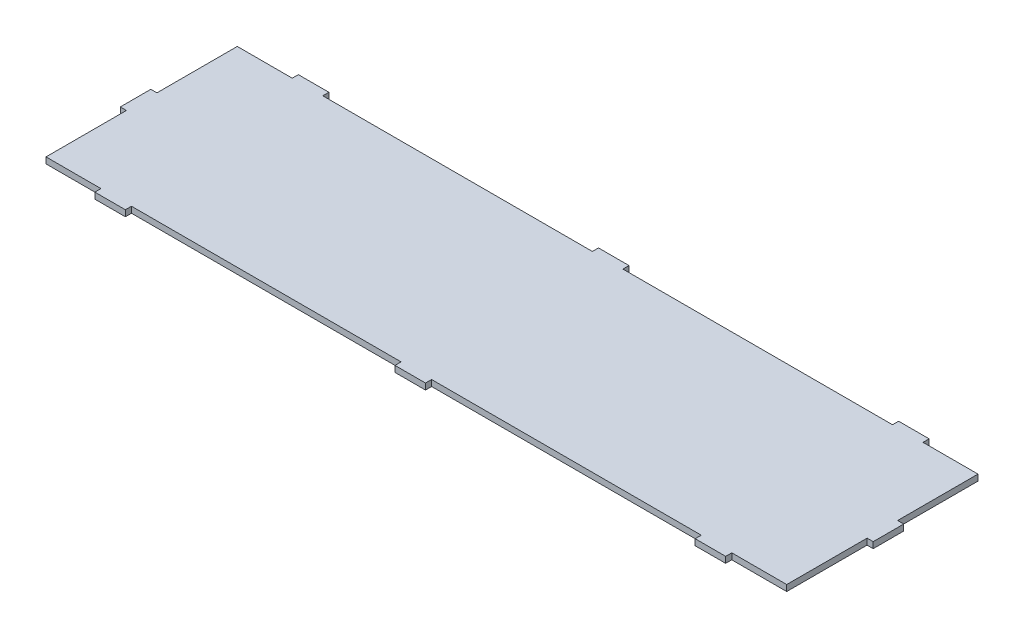
ISO-10303-21;
HEADER;
FILE_DESCRIPTION(('STEP AP214'),'2;1');
FILE_NAME('part.step','',(''),(''),'','','');
FILE_SCHEMA(('AUTOMOTIVE_DESIGN { 1 0 10303 214 1 1 1 1 }'));
ENDSEC;
DATA;
#1=APPLICATION_CONTEXT('core data for automotive mechanical design processes');
#2=APPLICATION_PROTOCOL_DEFINITION('international standard','automotive_design',2000,#1);
#3=PRODUCT_CONTEXT('',#1,'mechanical');
#4=PRODUCT('Part','Part','',(#3));
#5=PRODUCT_RELATED_PRODUCT_CATEGORY('part','',(#4));
#6=PRODUCT_DEFINITION_FORMATION('','',#4);
#7=PRODUCT_DEFINITION_CONTEXT('part definition',#1,'design');
#8=PRODUCT_DEFINITION('design','',#6,#7);
#9=PRODUCT_DEFINITION_SHAPE('','',#8);
#10=(LENGTH_UNIT() NAMED_UNIT(*) SI_UNIT(.MILLI.,.METRE.));
#11=(NAMED_UNIT(*) PLANE_ANGLE_UNIT() SI_UNIT($,.RADIAN.));
#12=(NAMED_UNIT(*) SI_UNIT($,.STERADIAN.) SOLID_ANGLE_UNIT());
#13=UNCERTAINTY_MEASURE_WITH_UNIT(LENGTH_MEASURE(1.E-05),#10,'distance_accuracy_value','');
#14=(GEOMETRIC_REPRESENTATION_CONTEXT(3) GLOBAL_UNCERTAINTY_ASSIGNED_CONTEXT((#13)) GLOBAL_UNIT_ASSIGNED_CONTEXT((#10,
#11,#12)) REPRESENTATION_CONTEXT('',''));
#15=CARTESIAN_POINT('',(0.,0.,0.));
#16=DIRECTION('',(0.,0.,1.));
#17=DIRECTION('',(1.,0.,0.));
#18=AXIS2_PLACEMENT_3D('',#15,#16,#17);
#19=CARTESIAN_POINT('',(3.,3.,3.));
#20=DIRECTION('',(0.,0.,1.));
#21=DIRECTION('',(1.,0.,0.));
#22=AXIS2_PLACEMENT_3D('',#19,#20,#21);
#23=PLANE('',#22);
#24=DIRECTION('',(-1.,0.,0.));
#25=VECTOR('',#24,1.);
#26=CARTESIAN_POINT('',(3.,0.,3.));
#27=LINE('',#26,#25);
#28=CARTESIAN_POINT('',(30.,0.,3.));
#29=VERTEX_POINT('',#28);
#30=CARTESIAN_POINT('',(3.,0.,3.));
#31=VERTEX_POINT('',#30);
#32=EDGE_CURVE('E300',#29,#31,#27,.T.);
#33=ORIENTED_EDGE('',*,*,#32,.T.);
#34=DIRECTION('',(0.,-1.,0.));
#35=VECTOR('',#34,1.);
#36=CARTESIAN_POINT('',(3.,3.,3.));
#37=LINE('',#36,#35);
#38=CARTESIAN_POINT('',(3.,3.,3.));
#39=VERTEX_POINT('',#38);
#40=EDGE_CURVE('E11',#39,#31,#37,.T.);
#41=ORIENTED_EDGE('',*,*,#40,.F.);
#42=DIRECTION('',(-1.,0.,0.));
#43=VECTOR('',#42,1.);
#44=CARTESIAN_POINT('',(3.,3.,3.));
#45=LINE('',#44,#43);
#46=CARTESIAN_POINT('',(30.,3.,3.));
#47=VERTEX_POINT('',#46);
#48=EDGE_CURVE('E370',#47,#39,#45,.T.);
#49=ORIENTED_EDGE('',*,*,#48,.F.);
#50=DIRECTION('',(0.,-1.,0.));
#51=VECTOR('',#50,1.);
#52=CARTESIAN_POINT('',(30.,3.,3.));
#53=LINE('',#52,#51);
#54=EDGE_CURVE('E296',#47,#29,#53,.T.);
#55=ORIENTED_EDGE('',*,*,#54,.T.);
#56=EDGE_LOOP('',(#33,#41,#49,#55));
#57=FACE_BOUND('',#56,.T.);
#58=ADVANCED_FACE('F36',(#57),#23,.F.);
#59=CARTESIAN_POINT('',(3.,3.,42.5));
#60=DIRECTION('',(1.,0.,0.));
#61=DIRECTION('',(0.,0.,-1.));
#62=AXIS2_PLACEMENT_3D('',#59,#60,#61);
#63=PLANE('',#62);
#64=DIRECTION('',(0.,0.,1.));
#65=VECTOR('',#64,1.);
#66=CARTESIAN_POINT('',(3.,0.,42.5));
#67=LINE('',#66,#65);
#68=CARTESIAN_POINT('',(3.,0.,42.5));
#69=VERTEX_POINT('',#68);
#70=EDGE_CURVE('E303',#31,#69,#67,.T.);
#71=ORIENTED_EDGE('',*,*,#70,.T.);
#72=DIRECTION('',(0.,-1.,0.));
#73=VECTOR('',#72,1.);
#74=CARTESIAN_POINT('',(3.,3.,42.5));
#75=LINE('',#74,#73);
#76=CARTESIAN_POINT('',(3.,3.,42.5));
#77=VERTEX_POINT('',#76);
#78=EDGE_CURVE('E44',#77,#69,#75,.T.);
#79=ORIENTED_EDGE('',*,*,#78,.F.);
#80=DIRECTION('',(0.,0.,1.));
#81=VECTOR('',#80,1.);
#82=CARTESIAN_POINT('',(3.,3.,42.5));
#83=LINE('',#82,#81);
#84=EDGE_CURVE('E179',#39,#77,#83,.T.);
#85=ORIENTED_EDGE('',*,*,#84,.F.);
#86=ORIENTED_EDGE('',*,*,#40,.T.);
#87=EDGE_LOOP('',(#71,#79,#85,#86));
#88=FACE_BOUND('',#87,.T.);
#89=ADVANCED_FACE('F568',(#88),#63,.F.);
#90=CARTESIAN_POINT('',(3.,3.,42.5));
#91=DIRECTION('',(0.,0.,1.));
#92=DIRECTION('',(1.,0.,0.));
#93=AXIS2_PLACEMENT_3D('',#90,#91,#92);
#94=PLANE('',#93);
#95=DIRECTION('',(-1.,0.,0.));
#96=VECTOR('',#95,1.);
#97=CARTESIAN_POINT('',(3.,0.,42.5));
#98=LINE('',#97,#96);
#99=CARTESIAN_POINT('',(0.,0.,42.5));
#100=VERTEX_POINT('',#99);
#101=EDGE_CURVE('E305',#69,#100,#98,.T.);
#102=ORIENTED_EDGE('',*,*,#101,.T.);
#103=DIRECTION('',(0.,-1.,0.));
#104=VECTOR('',#103,1.);
#105=CARTESIAN_POINT('',(0.,3.,42.5));
#106=LINE('',#105,#104);
#107=CARTESIAN_POINT('',(0.,3.,42.5));
#108=VERTEX_POINT('',#107);
#109=EDGE_CURVE('E461',#108,#100,#106,.T.);
#110=ORIENTED_EDGE('',*,*,#109,.F.);
#111=DIRECTION('',(-1.,0.,0.));
#112=VECTOR('',#111,1.);
#113=CARTESIAN_POINT('',(3.,3.,42.5));
#114=LINE('',#113,#112);
#115=EDGE_CURVE('E469',#77,#108,#114,.T.);
#116=ORIENTED_EDGE('',*,*,#115,.F.);
#117=ORIENTED_EDGE('',*,*,#78,.T.);
#118=EDGE_LOOP('',(#102,#110,#116,#117));
#119=FACE_BOUND('',#118,.T.);
#120=ADVANCED_FACE('F467',(#119),#94,.F.);
#121=CARTESIAN_POINT('',(0.,3.,42.5));
#122=DIRECTION('',(1.,0.,0.));
#123=DIRECTION('',(0.,0.,-1.));
#124=AXIS2_PLACEMENT_3D('',#121,#122,#123);
#125=PLANE('',#124);
#126=DIRECTION('',(0.,0.,1.));
#127=VECTOR('',#126,1.);
#128=CARTESIAN_POINT('',(0.,0.,42.5));
#129=LINE('',#128,#127);
#130=CARTESIAN_POINT('',(0.,0.,57.5));
#131=VERTEX_POINT('',#130);
#132=EDGE_CURVE('E307',#100,#131,#129,.T.);
#133=ORIENTED_EDGE('',*,*,#132,.T.);
#134=DIRECTION('',(0.,-1.,0.));
#135=VECTOR('',#134,1.);
#136=CARTESIAN_POINT('',(0.,3.,57.5));
#137=LINE('',#136,#135);
#138=CARTESIAN_POINT('',(0.,3.,57.5));
#139=VERTEX_POINT('',#138);
#140=EDGE_CURVE('E458',#139,#131,#137,.T.);
#141=ORIENTED_EDGE('',*,*,#140,.F.);
#142=DIRECTION('',(0.,0.,1.));
#143=VECTOR('',#142,1.);
#144=CARTESIAN_POINT('',(0.,3.,42.5));
#145=LINE('',#144,#143);
#146=EDGE_CURVE('E487',#108,#139,#145,.T.);
#147=ORIENTED_EDGE('',*,*,#146,.F.);
#148=ORIENTED_EDGE('',*,*,#109,.T.);
#149=EDGE_LOOP('',(#133,#141,#147,#148));
#150=FACE_BOUND('',#149,.T.);
#151=ADVANCED_FACE('F478',(#150),#125,.F.);
#152=CARTESIAN_POINT('',(3.,3.,57.5));
#153=DIRECTION('',(0.,0.,-1.));
#154=DIRECTION('',(-1.,0.,0.));
#155=AXIS2_PLACEMENT_3D('',#152,#153,#154);
#156=PLANE('',#155);
#157=DIRECTION('',(1.,0.,0.));
#158=VECTOR('',#157,1.);
#159=CARTESIAN_POINT('',(3.,0.,57.5));
#160=LINE('',#159,#158);
#161=CARTESIAN_POINT('',(3.,0.,57.5));
#162=VERTEX_POINT('',#161);
#163=EDGE_CURVE('E309',#131,#162,#160,.T.);
#164=ORIENTED_EDGE('',*,*,#163,.T.);
#165=DIRECTION('',(0.,-1.,0.));
#166=VECTOR('',#165,1.);
#167=CARTESIAN_POINT('',(3.,3.,57.5));
#168=LINE('',#167,#166);
#169=CARTESIAN_POINT('',(3.,3.,57.5));
#170=VERTEX_POINT('',#169);
#171=EDGE_CURVE('E455',#170,#162,#168,.T.);
#172=ORIENTED_EDGE('',*,*,#171,.F.);
#173=DIRECTION('',(1.,0.,0.));
#174=VECTOR('',#173,1.);
#175=CARTESIAN_POINT('',(3.,3.,57.5));
#176=LINE('',#175,#174);
#177=EDGE_CURVE('E484',#139,#170,#176,.T.);
#178=ORIENTED_EDGE('',*,*,#177,.F.);
#179=ORIENTED_EDGE('',*,*,#140,.T.);
#180=EDGE_LOOP('',(#164,#172,#178,#179));
#181=FACE_BOUND('',#180,.T.);
#182=ADVANCED_FACE('F482',(#181),#156,.F.);
#183=CARTESIAN_POINT('',(3.,3.,57.5));
#184=DIRECTION('',(1.,0.,0.));
#185=DIRECTION('',(0.,0.,-1.));
#186=AXIS2_PLACEMENT_3D('',#183,#184,#185);
#187=PLANE('',#186);
#188=DIRECTION('',(0.,0.,1.));
#189=VECTOR('',#188,1.);
#190=CARTESIAN_POINT('',(3.,0.,57.5));
#191=LINE('',#190,#189);
#192=CARTESIAN_POINT('',(3.,0.,97.));
#193=VERTEX_POINT('',#192);
#194=EDGE_CURVE('E311',#162,#193,#191,.T.);
#195=ORIENTED_EDGE('',*,*,#194,.T.);
#196=DIRECTION('',(0.,-1.,0.));
#197=VECTOR('',#196,1.);
#198=CARTESIAN_POINT('',(3.,3.,97.));
#199=LINE('',#198,#197);
#200=CARTESIAN_POINT('',(3.,3.,97.));
#201=VERTEX_POINT('',#200);
#202=EDGE_CURVE('E452',#201,#193,#199,.T.);
#203=ORIENTED_EDGE('',*,*,#202,.F.);
#204=DIRECTION('',(0.,0.,1.));
#205=VECTOR('',#204,1.);
#206=CARTESIAN_POINT('',(3.,3.,57.5));
#207=LINE('',#206,#205);
#208=EDGE_CURVE('E486',#170,#201,#207,.T.);
#209=ORIENTED_EDGE('',*,*,#208,.F.);
#210=ORIENTED_EDGE('',*,*,#171,.T.);
#211=EDGE_LOOP('',(#195,#203,#209,#210));
#212=FACE_BOUND('',#211,.T.);
#213=ADVANCED_FACE('F581',(#212),#187,.F.);
#214=CARTESIAN_POINT('',(3.,3.,97.));
#215=DIRECTION('',(0.,0.,-1.));
#216=DIRECTION('',(-1.,0.,0.));
#217=AXIS2_PLACEMENT_3D('',#214,#215,#216);
#218=PLANE('',#217);
#219=DIRECTION('',(1.,0.,0.));
#220=VECTOR('',#219,1.);
#221=CARTESIAN_POINT('',(3.,0.,97.));
#222=LINE('',#221,#220);
#223=CARTESIAN_POINT('',(30.,0.,97.));
#224=VERTEX_POINT('',#223);
#225=EDGE_CURVE('E313',#193,#224,#222,.T.);
#226=ORIENTED_EDGE('',*,*,#225,.T.);
#227=DIRECTION('',(0.,-1.,0.));
#228=VECTOR('',#227,1.);
#229=CARTESIAN_POINT('',(30.,3.,97.));
#230=LINE('',#229,#228);
#231=CARTESIAN_POINT('',(30.,3.,97.));
#232=VERTEX_POINT('',#231);
#233=EDGE_CURVE('E449',#232,#224,#230,.T.);
#234=ORIENTED_EDGE('',*,*,#233,.F.);
#235=DIRECTION('',(1.,0.,0.));
#236=VECTOR('',#235,1.);
#237=CARTESIAN_POINT('',(3.,3.,97.));
#238=LINE('',#237,#236);
#239=EDGE_CURVE('E489',#201,#232,#238,.T.);
#240=ORIENTED_EDGE('',*,*,#239,.F.);
#241=ORIENTED_EDGE('',*,*,#202,.T.);
#242=EDGE_LOOP('',(#226,#234,#240,#241));
#243=FACE_BOUND('',#242,.T.);
#244=ADVANCED_FACE('F584',(#243),#218,.F.);
#245=CARTESIAN_POINT('',(30.,3.,100.));
#246=DIRECTION('',(1.,0.,0.));
#247=DIRECTION('',(0.,0.,-1.));
#248=AXIS2_PLACEMENT_3D('',#245,#246,#247);
#249=PLANE('',#248);
#250=DIRECTION('',(0.,0.,1.));
#251=VECTOR('',#250,1.);
#252=CARTESIAN_POINT('',(30.,0.,100.));
#253=LINE('',#252,#251);
#254=CARTESIAN_POINT('',(30.,0.,100.));
#255=VERTEX_POINT('',#254);
#256=EDGE_CURVE('E315',#224,#255,#253,.T.);
#257=ORIENTED_EDGE('',*,*,#256,.T.);
#258=DIRECTION('',(0.,-1.,0.));
#259=VECTOR('',#258,1.);
#260=CARTESIAN_POINT('',(30.,3.,100.));
#261=LINE('',#260,#259);
#262=CARTESIAN_POINT('',(30.,3.,100.));
#263=VERTEX_POINT('',#262);
#264=EDGE_CURVE('E446',#263,#255,#261,.T.);
#265=ORIENTED_EDGE('',*,*,#264,.F.);
#266=DIRECTION('',(0.,0.,1.));
#267=VECTOR('',#266,1.);
#268=CARTESIAN_POINT('',(30.,3.,100.));
#269=LINE('',#268,#267);
#270=EDGE_CURVE('E495',#232,#263,#269,.T.);
#271=ORIENTED_EDGE('',*,*,#270,.F.);
#272=ORIENTED_EDGE('',*,*,#233,.T.);
#273=EDGE_LOOP('',(#257,#265,#271,#272));
#274=FACE_BOUND('',#273,.T.);
#275=ADVANCED_FACE('F588',(#274),#249,.F.);
#276=CARTESIAN_POINT('',(45.,3.,100.));
#277=DIRECTION('',(0.,0.,-1.));
#278=DIRECTION('',(-1.,0.,0.));
#279=AXIS2_PLACEMENT_3D('',#276,#277,#278);
#280=PLANE('',#279);
#281=DIRECTION('',(1.,0.,0.));
#282=VECTOR('',#281,1.);
#283=CARTESIAN_POINT('',(45.,0.,100.));
#284=LINE('',#283,#282);
#285=CARTESIAN_POINT('',(45.,0.,100.));
#286=VERTEX_POINT('',#285);
#287=EDGE_CURVE('E317',#255,#286,#284,.T.);
#288=ORIENTED_EDGE('',*,*,#287,.T.);
#289=DIRECTION('',(0.,-1.,0.));
#290=VECTOR('',#289,1.);
#291=CARTESIAN_POINT('',(45.,3.,100.));
#292=LINE('',#291,#290);
#293=CARTESIAN_POINT('',(45.,3.,100.));
#294=VERTEX_POINT('',#293);
#295=EDGE_CURVE('E443',#294,#286,#292,.T.);
#296=ORIENTED_EDGE('',*,*,#295,.F.);
#297=DIRECTION('',(1.,0.,0.));
#298=VECTOR('',#297,1.);
#299=CARTESIAN_POINT('',(45.,3.,100.));
#300=LINE('',#299,#298);
#301=EDGE_CURVE('E497',#263,#294,#300,.T.);
#302=ORIENTED_EDGE('',*,*,#301,.F.);
#303=ORIENTED_EDGE('',*,*,#264,.T.);
#304=EDGE_LOOP('',(#288,#296,#302,#303));
#305=FACE_BOUND('',#304,.T.);
#306=ADVANCED_FACE('F592',(#305),#280,.F.);
#307=CARTESIAN_POINT('',(45.,3.,97.));
#308=DIRECTION('',(-1.,0.,0.));
#309=DIRECTION('',(0.,0.,1.));
#310=AXIS2_PLACEMENT_3D('',#307,#308,#309);
#311=PLANE('',#310);
#312=DIRECTION('',(0.,0.,-1.));
#313=VECTOR('',#312,1.);
#314=CARTESIAN_POINT('',(45.,0.,97.));
#315=LINE('',#314,#313);
#316=CARTESIAN_POINT('',(45.,0.,97.));
#317=VERTEX_POINT('',#316);
#318=EDGE_CURVE('E319',#286,#317,#315,.T.);
#319=ORIENTED_EDGE('',*,*,#318,.T.);
#320=DIRECTION('',(0.,-1.,0.));
#321=VECTOR('',#320,1.);
#322=CARTESIAN_POINT('',(45.,3.,97.));
#323=LINE('',#322,#321);
#324=CARTESIAN_POINT('',(45.,3.,97.));
#325=VERTEX_POINT('',#324);
#326=EDGE_CURVE('E440',#325,#317,#323,.T.);
#327=ORIENTED_EDGE('',*,*,#326,.F.);
#328=DIRECTION('',(0.,0.,-1.));
#329=VECTOR('',#328,1.);
#330=CARTESIAN_POINT('',(45.,3.,97.));
#331=LINE('',#330,#329);
#332=EDGE_CURVE('E499',#294,#325,#331,.T.);
#333=ORIENTED_EDGE('',*,*,#332,.F.);
#334=ORIENTED_EDGE('',*,*,#295,.T.);
#335=EDGE_LOOP('',(#319,#327,#333,#334));
#336=FACE_BOUND('',#335,.T.);
#337=ADVANCED_FACE('F596',(#336),#311,.F.);
#338=CARTESIAN_POINT('',(45.,3.,97.));
#339=DIRECTION('',(0.,0.,-1.));
#340=DIRECTION('',(-1.,0.,0.));
#341=AXIS2_PLACEMENT_3D('',#338,#339,#340);
#342=PLANE('',#341);
#343=DIRECTION('',(1.,0.,0.));
#344=VECTOR('',#343,1.);
#345=CARTESIAN_POINT('',(45.,0.,97.));
#346=LINE('',#345,#344);
#347=CARTESIAN_POINT('',(177.5,0.,97.));
#348=VERTEX_POINT('',#347);
#349=EDGE_CURVE('E321',#317,#348,#346,.T.);
#350=ORIENTED_EDGE('',*,*,#349,.T.);
#351=DIRECTION('',(0.,-1.,0.));
#352=VECTOR('',#351,1.);
#353=CARTESIAN_POINT('',(177.5,3.,97.));
#354=LINE('',#353,#352);
#355=CARTESIAN_POINT('',(177.5,3.,97.));
#356=VERTEX_POINT('',#355);
#357=EDGE_CURVE('E437',#356,#348,#354,.T.);
#358=ORIENTED_EDGE('',*,*,#357,.F.);
#359=DIRECTION('',(1.,0.,0.));
#360=VECTOR('',#359,1.);
#361=CARTESIAN_POINT('',(45.,3.,97.));
#362=LINE('',#361,#360);
#363=EDGE_CURVE('E501',#325,#356,#362,.T.);
#364=ORIENTED_EDGE('',*,*,#363,.F.);
#365=ORIENTED_EDGE('',*,*,#326,.T.);
#366=EDGE_LOOP('',(#350,#358,#364,#365));
#367=FACE_BOUND('',#366,.T.);
#368=ADVANCED_FACE('F600',(#367),#342,.F.);
#369=CARTESIAN_POINT('',(177.5,3.,97.));
#370=DIRECTION('',(1.,0.,0.));
#371=DIRECTION('',(0.,0.,-1.));
#372=AXIS2_PLACEMENT_3D('',#369,#370,#371);
#373=PLANE('',#372);
#374=DIRECTION('',(0.,0.,1.));
#375=VECTOR('',#374,1.);
#376=CARTESIAN_POINT('',(177.5,0.,97.));
#377=LINE('',#376,#375);
#378=CARTESIAN_POINT('',(177.5,0.,100.));
#379=VERTEX_POINT('',#378);
#380=EDGE_CURVE('E323',#348,#379,#377,.T.);
#381=ORIENTED_EDGE('',*,*,#380,.T.);
#382=DIRECTION('',(0.,-1.,0.));
#383=VECTOR('',#382,1.);
#384=CARTESIAN_POINT('',(177.5,3.,100.));
#385=LINE('',#384,#383);
#386=CARTESIAN_POINT('',(177.5,3.,100.));
#387=VERTEX_POINT('',#386);
#388=EDGE_CURVE('E434',#387,#379,#385,.T.);
#389=ORIENTED_EDGE('',*,*,#388,.F.);
#390=DIRECTION('',(0.,0.,1.));
#391=VECTOR('',#390,1.);
#392=CARTESIAN_POINT('',(177.5,3.,97.));
#393=LINE('',#392,#391);
#394=EDGE_CURVE('E503',#356,#387,#393,.T.);
#395=ORIENTED_EDGE('',*,*,#394,.F.);
#396=ORIENTED_EDGE('',*,*,#357,.T.);
#397=EDGE_LOOP('',(#381,#389,#395,#396));
#398=FACE_BOUND('',#397,.T.);
#399=ADVANCED_FACE('F604',(#398),#373,.F.);
#400=CARTESIAN_POINT('',(192.5,3.,100.));
#401=DIRECTION('',(0.,0.,-1.));
#402=DIRECTION('',(-1.,0.,0.));
#403=AXIS2_PLACEMENT_3D('',#400,#401,#402);
#404=PLANE('',#403);
#405=DIRECTION('',(1.,0.,0.));
#406=VECTOR('',#405,1.);
#407=CARTESIAN_POINT('',(192.5,0.,100.));
#408=LINE('',#407,#406);
#409=CARTESIAN_POINT('',(192.5,0.,100.));
#410=VERTEX_POINT('',#409);
#411=EDGE_CURVE('E325',#379,#410,#408,.T.);
#412=ORIENTED_EDGE('',*,*,#411,.T.);
#413=DIRECTION('',(0.,-1.,0.));
#414=VECTOR('',#413,1.);
#415=CARTESIAN_POINT('',(192.5,3.,100.));
#416=LINE('',#415,#414);
#417=CARTESIAN_POINT('',(192.5,3.,100.));
#418=VERTEX_POINT('',#417);
#419=EDGE_CURVE('E431',#418,#410,#416,.T.);
#420=ORIENTED_EDGE('',*,*,#419,.F.);
#421=DIRECTION('',(1.,0.,0.));
#422=VECTOR('',#421,1.);
#423=CARTESIAN_POINT('',(192.5,3.,100.));
#424=LINE('',#423,#422);
#425=EDGE_CURVE('E505',#387,#418,#424,.T.);
#426=ORIENTED_EDGE('',*,*,#425,.F.);
#427=ORIENTED_EDGE('',*,*,#388,.T.);
#428=EDGE_LOOP('',(#412,#420,#426,#427));
#429=FACE_BOUND('',#428,.T.);
#430=ADVANCED_FACE('F608',(#429),#404,.F.);
#431=CARTESIAN_POINT('',(192.5,3.,97.));
#432=DIRECTION('',(-1.,0.,0.));
#433=DIRECTION('',(0.,0.,1.));
#434=AXIS2_PLACEMENT_3D('',#431,#432,#433);
#435=PLANE('',#434);
#436=DIRECTION('',(0.,0.,-1.));
#437=VECTOR('',#436,1.);
#438=CARTESIAN_POINT('',(192.5,0.,97.));
#439=LINE('',#438,#437);
#440=CARTESIAN_POINT('',(192.5,0.,97.));
#441=VERTEX_POINT('',#440);
#442=EDGE_CURVE('E327',#410,#441,#439,.T.);
#443=ORIENTED_EDGE('',*,*,#442,.T.);
#444=DIRECTION('',(0.,-1.,0.));
#445=VECTOR('',#444,1.);
#446=CARTESIAN_POINT('',(192.5,3.,97.));
#447=LINE('',#446,#445);
#448=CARTESIAN_POINT('',(192.5,3.,97.));
#449=VERTEX_POINT('',#448);
#450=EDGE_CURVE('E428',#449,#441,#447,.T.);
#451=ORIENTED_EDGE('',*,*,#450,.F.);
#452=DIRECTION('',(0.,0.,-1.));
#453=VECTOR('',#452,1.);
#454=CARTESIAN_POINT('',(192.5,3.,97.));
#455=LINE('',#454,#453);
#456=EDGE_CURVE('E507',#418,#449,#455,.T.);
#457=ORIENTED_EDGE('',*,*,#456,.F.);
#458=ORIENTED_EDGE('',*,*,#419,.T.);
#459=EDGE_LOOP('',(#443,#451,#457,#458));
#460=FACE_BOUND('',#459,.T.);
#461=ADVANCED_FACE('F612',(#460),#435,.F.);
#462=CARTESIAN_POINT('',(192.5,3.,97.));
#463=DIRECTION('',(0.,0.,-1.));
#464=DIRECTION('',(-1.,0.,0.));
#465=AXIS2_PLACEMENT_3D('',#462,#463,#464);
#466=PLANE('',#465);
#467=DIRECTION('',(1.,0.,0.));
#468=VECTOR('',#467,1.);
#469=CARTESIAN_POINT('',(192.5,0.,97.));
#470=LINE('',#469,#468);
#471=CARTESIAN_POINT('',(325.,0.,97.));
#472=VERTEX_POINT('',#471);
#473=EDGE_CURVE('E329',#441,#472,#470,.T.);
#474=ORIENTED_EDGE('',*,*,#473,.T.);
#475=DIRECTION('',(0.,-1.,0.));
#476=VECTOR('',#475,1.);
#477=CARTESIAN_POINT('',(325.,3.,97.));
#478=LINE('',#477,#476);
#479=CARTESIAN_POINT('',(325.,3.,97.));
#480=VERTEX_POINT('',#479);
#481=EDGE_CURVE('E425',#480,#472,#478,.T.);
#482=ORIENTED_EDGE('',*,*,#481,.F.);
#483=DIRECTION('',(1.,0.,0.));
#484=VECTOR('',#483,1.);
#485=CARTESIAN_POINT('',(192.5,3.,97.));
#486=LINE('',#485,#484);
#487=EDGE_CURVE('E509',#449,#480,#486,.T.);
#488=ORIENTED_EDGE('',*,*,#487,.F.);
#489=ORIENTED_EDGE('',*,*,#450,.T.);
#490=EDGE_LOOP('',(#474,#482,#488,#489));
#491=FACE_BOUND('',#490,.T.);
#492=ADVANCED_FACE('F616',(#491),#466,.F.);
#493=CARTESIAN_POINT('',(325.,3.,97.));
#494=DIRECTION('',(1.,0.,0.));
#495=DIRECTION('',(0.,0.,-1.));
#496=AXIS2_PLACEMENT_3D('',#493,#494,#495);
#497=PLANE('',#496);
#498=DIRECTION('',(0.,0.,1.));
#499=VECTOR('',#498,1.);
#500=CARTESIAN_POINT('',(325.,0.,97.));
#501=LINE('',#500,#499);
#502=CARTESIAN_POINT('',(325.,0.,100.));
#503=VERTEX_POINT('',#502);
#504=EDGE_CURVE('E331',#472,#503,#501,.T.);
#505=ORIENTED_EDGE('',*,*,#504,.T.);
#506=DIRECTION('',(0.,-1.,0.));
#507=VECTOR('',#506,1.);
#508=CARTESIAN_POINT('',(325.,3.,100.));
#509=LINE('',#508,#507);
#510=CARTESIAN_POINT('',(325.,3.,100.));
#511=VERTEX_POINT('',#510);
#512=EDGE_CURVE('E422',#511,#503,#509,.T.);
#513=ORIENTED_EDGE('',*,*,#512,.F.);
#514=DIRECTION('',(0.,0.,1.));
#515=VECTOR('',#514,1.);
#516=CARTESIAN_POINT('',(325.,3.,97.));
#517=LINE('',#516,#515);
#518=EDGE_CURVE('E511',#480,#511,#517,.T.);
#519=ORIENTED_EDGE('',*,*,#518,.F.);
#520=ORIENTED_EDGE('',*,*,#481,.T.);
#521=EDGE_LOOP('',(#505,#513,#519,#520));
#522=FACE_BOUND('',#521,.T.);
#523=ADVANCED_FACE('F620',(#522),#497,.F.);
#524=CARTESIAN_POINT('',(340.,3.,100.));
#525=DIRECTION('',(0.,0.,-1.));
#526=DIRECTION('',(-1.,0.,0.));
#527=AXIS2_PLACEMENT_3D('',#524,#525,#526);
#528=PLANE('',#527);
#529=DIRECTION('',(1.,0.,0.));
#530=VECTOR('',#529,1.);
#531=CARTESIAN_POINT('',(340.,0.,100.));
#532=LINE('',#531,#530);
#533=CARTESIAN_POINT('',(340.,0.,100.));
#534=VERTEX_POINT('',#533);
#535=EDGE_CURVE('E333',#503,#534,#532,.T.);
#536=ORIENTED_EDGE('',*,*,#535,.T.);
#537=DIRECTION('',(0.,-1.,0.));
#538=VECTOR('',#537,1.);
#539=CARTESIAN_POINT('',(340.,3.,100.));
#540=LINE('',#539,#538);
#541=CARTESIAN_POINT('',(340.,3.,100.));
#542=VERTEX_POINT('',#541);
#543=EDGE_CURVE('E419',#542,#534,#540,.T.);
#544=ORIENTED_EDGE('',*,*,#543,.F.);
#545=DIRECTION('',(1.,0.,0.));
#546=VECTOR('',#545,1.);
#547=CARTESIAN_POINT('',(340.,3.,100.));
#548=LINE('',#547,#546);
#549=EDGE_CURVE('E513',#511,#542,#548,.T.);
#550=ORIENTED_EDGE('',*,*,#549,.F.);
#551=ORIENTED_EDGE('',*,*,#512,.T.);
#552=EDGE_LOOP('',(#536,#544,#550,#551));
#553=FACE_BOUND('',#552,.T.);
#554=ADVANCED_FACE('F624',(#553),#528,.F.);
#555=CARTESIAN_POINT('',(340.,3.,100.));
#556=DIRECTION('',(-1.,0.,0.));
#557=DIRECTION('',(0.,0.,1.));
#558=AXIS2_PLACEMENT_3D('',#555,#556,#557);
#559=PLANE('',#558);
#560=DIRECTION('',(0.,0.,-1.));
#561=VECTOR('',#560,1.);
#562=CARTESIAN_POINT('',(340.,0.,100.));
#563=LINE('',#562,#561);
#564=CARTESIAN_POINT('',(340.,0.,97.));
#565=VERTEX_POINT('',#564);
#566=EDGE_CURVE('E335',#534,#565,#563,.T.);
#567=ORIENTED_EDGE('',*,*,#566,.T.);
#568=DIRECTION('',(0.,-1.,0.));
#569=VECTOR('',#568,1.);
#570=CARTESIAN_POINT('',(340.,3.,97.));
#571=LINE('',#570,#569);
#572=CARTESIAN_POINT('',(340.,3.,97.));
#573=VERTEX_POINT('',#572);
#574=EDGE_CURVE('E416',#573,#565,#571,.T.);
#575=ORIENTED_EDGE('',*,*,#574,.F.);
#576=DIRECTION('',(0.,0.,-1.));
#577=VECTOR('',#576,1.);
#578=CARTESIAN_POINT('',(340.,3.,100.));
#579=LINE('',#578,#577);
#580=EDGE_CURVE('E515',#542,#573,#579,.T.);
#581=ORIENTED_EDGE('',*,*,#580,.F.);
#582=ORIENTED_EDGE('',*,*,#543,.T.);
#583=EDGE_LOOP('',(#567,#575,#581,#582));
#584=FACE_BOUND('',#583,.T.);
#585=ADVANCED_FACE('F628',(#584),#559,.F.);
#586=CARTESIAN_POINT('',(340.,3.,97.));
#587=DIRECTION('',(0.,0.,-1.));
#588=DIRECTION('',(-1.,0.,0.));
#589=AXIS2_PLACEMENT_3D('',#586,#587,#588);
#590=PLANE('',#589);
#591=DIRECTION('',(1.,0.,0.));
#592=VECTOR('',#591,1.);
#593=CARTESIAN_POINT('',(340.,0.,97.));
#594=LINE('',#593,#592);
#595=CARTESIAN_POINT('',(367.,0.,97.));
#596=VERTEX_POINT('',#595);
#597=EDGE_CURVE('E337',#565,#596,#594,.T.);
#598=ORIENTED_EDGE('',*,*,#597,.T.);
#599=DIRECTION('',(0.,-1.,0.));
#600=VECTOR('',#599,1.);
#601=CARTESIAN_POINT('',(367.,3.,97.));
#602=LINE('',#601,#600);
#603=CARTESIAN_POINT('',(367.,3.,97.));
#604=VERTEX_POINT('',#603);
#605=EDGE_CURVE('E413',#604,#596,#602,.T.);
#606=ORIENTED_EDGE('',*,*,#605,.F.);
#607=DIRECTION('',(1.,0.,0.));
#608=VECTOR('',#607,1.);
#609=CARTESIAN_POINT('',(340.,3.,97.));
#610=LINE('',#609,#608);
#611=EDGE_CURVE('E517',#573,#604,#610,.T.);
#612=ORIENTED_EDGE('',*,*,#611,.F.);
#613=ORIENTED_EDGE('',*,*,#574,.T.);
#614=EDGE_LOOP('',(#598,#606,#612,#613));
#615=FACE_BOUND('',#614,.T.);
#616=ADVANCED_FACE('F632',(#615),#590,.F.);
#617=CARTESIAN_POINT('',(367.,3.,57.5));
#618=DIRECTION('',(-1.,0.,0.));
#619=DIRECTION('',(0.,0.,1.));
#620=AXIS2_PLACEMENT_3D('',#617,#618,#619);
#621=PLANE('',#620);
#622=DIRECTION('',(0.,0.,-1.));
#623=VECTOR('',#622,1.);
#624=CARTESIAN_POINT('',(367.,0.,57.5));
#625=LINE('',#624,#623);
#626=CARTESIAN_POINT('',(367.,0.,57.5));
#627=VERTEX_POINT('',#626);
#628=EDGE_CURVE('E339',#596,#627,#625,.T.);
#629=ORIENTED_EDGE('',*,*,#628,.T.);
#630=DIRECTION('',(0.,-1.,0.));
#631=VECTOR('',#630,1.);
#632=CARTESIAN_POINT('',(367.,3.,57.5));
#633=LINE('',#632,#631);
#634=CARTESIAN_POINT('',(367.,3.,57.5));
#635=VERTEX_POINT('',#634);
#636=EDGE_CURVE('E410',#635,#627,#633,.T.);
#637=ORIENTED_EDGE('',*,*,#636,.F.);
#638=DIRECTION('',(0.,0.,-1.));
#639=VECTOR('',#638,1.);
#640=CARTESIAN_POINT('',(367.,3.,57.5));
#641=LINE('',#640,#639);
#642=EDGE_CURVE('E519',#604,#635,#641,.T.);
#643=ORIENTED_EDGE('',*,*,#642,.F.);
#644=ORIENTED_EDGE('',*,*,#605,.T.);
#645=EDGE_LOOP('',(#629,#637,#643,#644));
#646=FACE_BOUND('',#645,.T.);
#647=ADVANCED_FACE('F636',(#646),#621,.F.);
#648=CARTESIAN_POINT('',(367.,3.,57.5));
#649=DIRECTION('',(0.,0.,-1.));
#650=DIRECTION('',(-1.,0.,0.));
#651=AXIS2_PLACEMENT_3D('',#648,#649,#650);
#652=PLANE('',#651);
#653=DIRECTION('',(1.,0.,0.));
#654=VECTOR('',#653,1.);
#655=CARTESIAN_POINT('',(367.,0.,57.5));
#656=LINE('',#655,#654);
#657=CARTESIAN_POINT('',(370.,0.,57.5));
#658=VERTEX_POINT('',#657);
#659=EDGE_CURVE('E341',#627,#658,#656,.T.);
#660=ORIENTED_EDGE('',*,*,#659,.T.);
#661=DIRECTION('',(0.,-1.,0.));
#662=VECTOR('',#661,1.);
#663=CARTESIAN_POINT('',(370.,3.,57.5));
#664=LINE('',#663,#662);
#665=CARTESIAN_POINT('',(370.,3.,57.5));
#666=VERTEX_POINT('',#665);
#667=EDGE_CURVE('E407',#666,#658,#664,.T.);
#668=ORIENTED_EDGE('',*,*,#667,.F.);
#669=DIRECTION('',(1.,0.,0.));
#670=VECTOR('',#669,1.);
#671=CARTESIAN_POINT('',(367.,3.,57.5));
#672=LINE('',#671,#670);
#673=EDGE_CURVE('E521',#635,#666,#672,.T.);
#674=ORIENTED_EDGE('',*,*,#673,.F.);
#675=ORIENTED_EDGE('',*,*,#636,.T.);
#676=EDGE_LOOP('',(#660,#668,#674,#675));
#677=FACE_BOUND('',#676,.T.);
#678=ADVANCED_FACE('F640',(#677),#652,.F.);
#679=CARTESIAN_POINT('',(370.,3.,42.5));
#680=DIRECTION('',(-1.,0.,0.));
#681=DIRECTION('',(0.,0.,1.));
#682=AXIS2_PLACEMENT_3D('',#679,#680,#681);
#683=PLANE('',#682);
#684=DIRECTION('',(0.,0.,-1.));
#685=VECTOR('',#684,1.);
#686=CARTESIAN_POINT('',(370.,0.,42.5));
#687=LINE('',#686,#685);
#688=CARTESIAN_POINT('',(370.,0.,42.5));
#689=VERTEX_POINT('',#688);
#690=EDGE_CURVE('E343',#658,#689,#687,.T.);
#691=ORIENTED_EDGE('',*,*,#690,.T.);
#692=DIRECTION('',(0.,-1.,0.));
#693=VECTOR('',#692,1.);
#694=CARTESIAN_POINT('',(370.,3.,42.5));
#695=LINE('',#694,#693);
#696=CARTESIAN_POINT('',(370.,3.,42.5));
#697=VERTEX_POINT('',#696);
#698=EDGE_CURVE('E404',#697,#689,#695,.T.);
#699=ORIENTED_EDGE('',*,*,#698,.F.);
#700=DIRECTION('',(0.,0.,-1.));
#701=VECTOR('',#700,1.);
#702=CARTESIAN_POINT('',(370.,3.,42.5));
#703=LINE('',#702,#701);
#704=EDGE_CURVE('E523',#666,#697,#703,.T.);
#705=ORIENTED_EDGE('',*,*,#704,.F.);
#706=ORIENTED_EDGE('',*,*,#667,.T.);
#707=EDGE_LOOP('',(#691,#699,#705,#706));
#708=FACE_BOUND('',#707,.T.);
#709=ADVANCED_FACE('F644',(#708),#683,.F.);
#710=CARTESIAN_POINT('',(367.,3.,42.5));
#711=DIRECTION('',(0.,0.,1.));
#712=DIRECTION('',(1.,0.,0.));
#713=AXIS2_PLACEMENT_3D('',#710,#711,#712);
#714=PLANE('',#713);
#715=DIRECTION('',(-1.,0.,0.));
#716=VECTOR('',#715,1.);
#717=CARTESIAN_POINT('',(367.,0.,42.5));
#718=LINE('',#717,#716);
#719=CARTESIAN_POINT('',(367.,0.,42.5));
#720=VERTEX_POINT('',#719);
#721=EDGE_CURVE('E345',#689,#720,#718,.T.);
#722=ORIENTED_EDGE('',*,*,#721,.T.);
#723=DIRECTION('',(0.,-1.,0.));
#724=VECTOR('',#723,1.);
#725=CARTESIAN_POINT('',(367.,3.,42.5));
#726=LINE('',#725,#724);
#727=CARTESIAN_POINT('',(367.,3.,42.5));
#728=VERTEX_POINT('',#727);
#729=EDGE_CURVE('E401',#728,#720,#726,.T.);
#730=ORIENTED_EDGE('',*,*,#729,.F.);
#731=DIRECTION('',(-1.,0.,0.));
#732=VECTOR('',#731,1.);
#733=CARTESIAN_POINT('',(367.,3.,42.5));
#734=LINE('',#733,#732);
#735=EDGE_CURVE('E525',#697,#728,#734,.T.);
#736=ORIENTED_EDGE('',*,*,#735,.F.);
#737=ORIENTED_EDGE('',*,*,#698,.T.);
#738=EDGE_LOOP('',(#722,#730,#736,#737));
#739=FACE_BOUND('',#738,.T.);
#740=ADVANCED_FACE('F648',(#739),#714,.F.);
#741=CARTESIAN_POINT('',(367.,3.,42.5));
#742=DIRECTION('',(-1.,0.,0.));
#743=DIRECTION('',(0.,0.,1.));
#744=AXIS2_PLACEMENT_3D('',#741,#742,#743);
#745=PLANE('',#744);
#746=DIRECTION('',(0.,0.,-1.));
#747=VECTOR('',#746,1.);
#748=CARTESIAN_POINT('',(367.,0.,42.5));
#749=LINE('',#748,#747);
#750=CARTESIAN_POINT('',(367.,0.,3.));
#751=VERTEX_POINT('',#750);
#752=EDGE_CURVE('E347',#720,#751,#749,.T.);
#753=ORIENTED_EDGE('',*,*,#752,.T.);
#754=DIRECTION('',(0.,-1.,0.));
#755=VECTOR('',#754,1.);
#756=CARTESIAN_POINT('',(367.,3.,3.));
#757=LINE('',#756,#755);
#758=CARTESIAN_POINT('',(367.,3.,3.));
#759=VERTEX_POINT('',#758);
#760=EDGE_CURVE('E398',#759,#751,#757,.T.);
#761=ORIENTED_EDGE('',*,*,#760,.F.);
#762=DIRECTION('',(0.,0.,-1.));
#763=VECTOR('',#762,1.);
#764=CARTESIAN_POINT('',(367.,3.,42.5));
#765=LINE('',#764,#763);
#766=EDGE_CURVE('E527',#728,#759,#765,.T.);
#767=ORIENTED_EDGE('',*,*,#766,.F.);
#768=ORIENTED_EDGE('',*,*,#729,.T.);
#769=EDGE_LOOP('',(#753,#761,#767,#768));
#770=FACE_BOUND('',#769,.T.);
#771=ADVANCED_FACE('F652',(#770),#745,.F.);
#772=CARTESIAN_POINT('',(340.,3.,3.));
#773=DIRECTION('',(0.,0.,1.));
#774=DIRECTION('',(1.,0.,0.));
#775=AXIS2_PLACEMENT_3D('',#772,#773,#774);
#776=PLANE('',#775);
#777=DIRECTION('',(-1.,0.,0.));
#778=VECTOR('',#777,1.);
#779=CARTESIAN_POINT('',(340.,0.,3.));
#780=LINE('',#779,#778);
#781=CARTESIAN_POINT('',(340.,0.,3.));
#782=VERTEX_POINT('',#781);
#783=EDGE_CURVE('E349',#751,#782,#780,.T.);
#784=ORIENTED_EDGE('',*,*,#783,.T.);
#785=DIRECTION('',(0.,-1.,0.));
#786=VECTOR('',#785,1.);
#787=CARTESIAN_POINT('',(340.,3.,3.));
#788=LINE('',#787,#786);
#789=CARTESIAN_POINT('',(340.,3.,3.));
#790=VERTEX_POINT('',#789);
#791=EDGE_CURVE('E395',#790,#782,#788,.T.);
#792=ORIENTED_EDGE('',*,*,#791,.F.);
#793=DIRECTION('',(-1.,0.,0.));
#794=VECTOR('',#793,1.);
#795=CARTESIAN_POINT('',(340.,3.,3.));
#796=LINE('',#795,#794);
#797=EDGE_CURVE('E529',#759,#790,#796,.T.);
#798=ORIENTED_EDGE('',*,*,#797,.F.);
#799=ORIENTED_EDGE('',*,*,#760,.T.);
#800=EDGE_LOOP('',(#784,#792,#798,#799));
#801=FACE_BOUND('',#800,.T.);
#802=ADVANCED_FACE('F656',(#801),#776,.F.);
#803=CARTESIAN_POINT('',(340.,3.,0.));
#804=DIRECTION('',(-1.,0.,0.));
#805=DIRECTION('',(0.,0.,1.));
#806=AXIS2_PLACEMENT_3D('',#803,#804,#805);
#807=PLANE('',#806);
#808=DIRECTION('',(0.,0.,-1.));
#809=VECTOR('',#808,1.);
#810=CARTESIAN_POINT('',(340.,0.,0.));
#811=LINE('',#810,#809);
#812=CARTESIAN_POINT('',(340.,0.,0.));
#813=VERTEX_POINT('',#812);
#814=EDGE_CURVE('E351',#782,#813,#811,.T.);
#815=ORIENTED_EDGE('',*,*,#814,.T.);
#816=DIRECTION('',(0.,-1.,0.));
#817=VECTOR('',#816,1.);
#818=CARTESIAN_POINT('',(340.,3.,0.));
#819=LINE('',#818,#817);
#820=CARTESIAN_POINT('',(340.,3.,0.));
#821=VERTEX_POINT('',#820);
#822=EDGE_CURVE('E392',#821,#813,#819,.T.);
#823=ORIENTED_EDGE('',*,*,#822,.F.);
#824=DIRECTION('',(0.,0.,-1.));
#825=VECTOR('',#824,1.);
#826=CARTESIAN_POINT('',(340.,3.,0.));
#827=LINE('',#826,#825);
#828=EDGE_CURVE('E531',#790,#821,#827,.T.);
#829=ORIENTED_EDGE('',*,*,#828,.F.);
#830=ORIENTED_EDGE('',*,*,#791,.T.);
#831=EDGE_LOOP('',(#815,#823,#829,#830));
#832=FACE_BOUND('',#831,.T.);
#833=ADVANCED_FACE('F660',(#832),#807,.F.);
#834=CARTESIAN_POINT('',(325.,3.,0.));
#835=DIRECTION('',(0.,0.,1.));
#836=DIRECTION('',(1.,0.,0.));
#837=AXIS2_PLACEMENT_3D('',#834,#835,#836);
#838=PLANE('',#837);
#839=DIRECTION('',(-1.,0.,0.));
#840=VECTOR('',#839,1.);
#841=CARTESIAN_POINT('',(325.,0.,0.));
#842=LINE('',#841,#840);
#843=CARTESIAN_POINT('',(325.,0.,0.));
#844=VERTEX_POINT('',#843);
#845=EDGE_CURVE('E353',#813,#844,#842,.T.);
#846=ORIENTED_EDGE('',*,*,#845,.T.);
#847=DIRECTION('',(0.,-1.,0.));
#848=VECTOR('',#847,1.);
#849=CARTESIAN_POINT('',(325.,3.,0.));
#850=LINE('',#849,#848);
#851=CARTESIAN_POINT('',(325.,3.,0.));
#852=VERTEX_POINT('',#851);
#853=EDGE_CURVE('E389',#852,#844,#850,.T.);
#854=ORIENTED_EDGE('',*,*,#853,.F.);
#855=DIRECTION('',(-1.,0.,0.));
#856=VECTOR('',#855,1.);
#857=CARTESIAN_POINT('',(325.,3.,0.));
#858=LINE('',#857,#856);
#859=EDGE_CURVE('E533',#821,#852,#858,.T.);
#860=ORIENTED_EDGE('',*,*,#859,.F.);
#861=ORIENTED_EDGE('',*,*,#822,.T.);
#862=EDGE_LOOP('',(#846,#854,#860,#861));
#863=FACE_BOUND('',#862,.T.);
#864=ADVANCED_FACE('F664',(#863),#838,.F.);
#865=CARTESIAN_POINT('',(325.,3.,3.));
#866=DIRECTION('',(1.,0.,0.));
#867=DIRECTION('',(0.,0.,-1.));
#868=AXIS2_PLACEMENT_3D('',#865,#866,#867);
#869=PLANE('',#868);
#870=DIRECTION('',(0.,0.,1.));
#871=VECTOR('',#870,1.);
#872=CARTESIAN_POINT('',(325.,0.,3.));
#873=LINE('',#872,#871);
#874=CARTESIAN_POINT('',(325.,0.,3.));
#875=VERTEX_POINT('',#874);
#876=EDGE_CURVE('E355',#844,#875,#873,.T.);
#877=ORIENTED_EDGE('',*,*,#876,.T.);
#878=DIRECTION('',(0.,-1.,0.));
#879=VECTOR('',#878,1.);
#880=CARTESIAN_POINT('',(325.,3.,3.));
#881=LINE('',#880,#879);
#882=CARTESIAN_POINT('',(325.,3.,3.));
#883=VERTEX_POINT('',#882);
#884=EDGE_CURVE('E386',#883,#875,#881,.T.);
#885=ORIENTED_EDGE('',*,*,#884,.F.);
#886=DIRECTION('',(0.,0.,1.));
#887=VECTOR('',#886,1.);
#888=CARTESIAN_POINT('',(325.,3.,3.));
#889=LINE('',#888,#887);
#890=EDGE_CURVE('E535',#852,#883,#889,.T.);
#891=ORIENTED_EDGE('',*,*,#890,.F.);
#892=ORIENTED_EDGE('',*,*,#853,.T.);
#893=EDGE_LOOP('',(#877,#885,#891,#892));
#894=FACE_BOUND('',#893,.T.);
#895=ADVANCED_FACE('F668',(#894),#869,.F.);
#896=CARTESIAN_POINT('',(192.5,3.,3.));
#897=DIRECTION('',(0.,0.,1.));
#898=DIRECTION('',(1.,0.,0.));
#899=AXIS2_PLACEMENT_3D('',#896,#897,#898);
#900=PLANE('',#899);
#901=DIRECTION('',(-1.,0.,0.));
#902=VECTOR('',#901,1.);
#903=CARTESIAN_POINT('',(192.5,0.,3.));
#904=LINE('',#903,#902);
#905=CARTESIAN_POINT('',(192.5,0.,3.));
#906=VERTEX_POINT('',#905);
#907=EDGE_CURVE('E357',#875,#906,#904,.T.);
#908=ORIENTED_EDGE('',*,*,#907,.T.);
#909=DIRECTION('',(0.,-1.,0.));
#910=VECTOR('',#909,1.);
#911=CARTESIAN_POINT('',(192.5,3.,3.));
#912=LINE('',#911,#910);
#913=CARTESIAN_POINT('',(192.5,3.,3.));
#914=VERTEX_POINT('',#913);
#915=EDGE_CURVE('E383',#914,#906,#912,.T.);
#916=ORIENTED_EDGE('',*,*,#915,.F.);
#917=DIRECTION('',(-1.,0.,0.));
#918=VECTOR('',#917,1.);
#919=CARTESIAN_POINT('',(192.5,3.,3.));
#920=LINE('',#919,#918);
#921=EDGE_CURVE('E537',#883,#914,#920,.T.);
#922=ORIENTED_EDGE('',*,*,#921,.F.);
#923=ORIENTED_EDGE('',*,*,#884,.T.);
#924=EDGE_LOOP('',(#908,#916,#922,#923));
#925=FACE_BOUND('',#924,.T.);
#926=ADVANCED_FACE('F672',(#925),#900,.F.);
#927=CARTESIAN_POINT('',(192.5,3.,3.));
#928=DIRECTION('',(-1.,0.,0.));
#929=DIRECTION('',(0.,0.,1.));
#930=AXIS2_PLACEMENT_3D('',#927,#928,#929);
#931=PLANE('',#930);
#932=DIRECTION('',(0.,0.,-1.));
#933=VECTOR('',#932,1.);
#934=CARTESIAN_POINT('',(192.5,0.,3.));
#935=LINE('',#934,#933);
#936=CARTESIAN_POINT('',(192.5,0.,0.));
#937=VERTEX_POINT('',#936);
#938=EDGE_CURVE('E359',#906,#937,#935,.T.);
#939=ORIENTED_EDGE('',*,*,#938,.T.);
#940=DIRECTION('',(0.,-1.,0.));
#941=VECTOR('',#940,1.);
#942=CARTESIAN_POINT('',(192.5,3.,0.));
#943=LINE('',#942,#941);
#944=CARTESIAN_POINT('',(192.5,3.,0.));
#945=VERTEX_POINT('',#944);
#946=EDGE_CURVE('E380',#945,#937,#943,.T.);
#947=ORIENTED_EDGE('',*,*,#946,.F.);
#948=DIRECTION('',(0.,0.,-1.));
#949=VECTOR('',#948,1.);
#950=CARTESIAN_POINT('',(192.5,3.,3.));
#951=LINE('',#950,#949);
#952=EDGE_CURVE('E539',#914,#945,#951,.T.);
#953=ORIENTED_EDGE('',*,*,#952,.F.);
#954=ORIENTED_EDGE('',*,*,#915,.T.);
#955=EDGE_LOOP('',(#939,#947,#953,#954));
#956=FACE_BOUND('',#955,.T.);
#957=ADVANCED_FACE('F676',(#956),#931,.F.);
#958=CARTESIAN_POINT('',(177.5,3.,0.));
#959=DIRECTION('',(0.,0.,1.));
#960=DIRECTION('',(1.,0.,0.));
#961=AXIS2_PLACEMENT_3D('',#958,#959,#960);
#962=PLANE('',#961);
#963=DIRECTION('',(-1.,0.,0.));
#964=VECTOR('',#963,1.);
#965=CARTESIAN_POINT('',(177.5,0.,0.));
#966=LINE('',#965,#964);
#967=CARTESIAN_POINT('',(177.5,0.,0.));
#968=VERTEX_POINT('',#967);
#969=EDGE_CURVE('E361',#937,#968,#966,.T.);
#970=ORIENTED_EDGE('',*,*,#969,.T.);
#971=DIRECTION('',(0.,-1.,0.));
#972=VECTOR('',#971,1.);
#973=CARTESIAN_POINT('',(177.5,3.,0.));
#974=LINE('',#973,#972);
#975=CARTESIAN_POINT('',(177.5,3.,0.));
#976=VERTEX_POINT('',#975);
#977=EDGE_CURVE('E377',#976,#968,#974,.T.);
#978=ORIENTED_EDGE('',*,*,#977,.F.);
#979=DIRECTION('',(-1.,0.,0.));
#980=VECTOR('',#979,1.);
#981=CARTESIAN_POINT('',(177.5,3.,0.));
#982=LINE('',#981,#980);
#983=EDGE_CURVE('E541',#945,#976,#982,.T.);
#984=ORIENTED_EDGE('',*,*,#983,.F.);
#985=ORIENTED_EDGE('',*,*,#946,.T.);
#986=EDGE_LOOP('',(#970,#978,#984,#985));
#987=FACE_BOUND('',#986,.T.);
#988=ADVANCED_FACE('F680',(#987),#962,.F.);
#989=CARTESIAN_POINT('',(177.5,3.,3.));
#990=DIRECTION('',(1.,0.,0.));
#991=DIRECTION('',(0.,0.,-1.));
#992=AXIS2_PLACEMENT_3D('',#989,#990,#991);
#993=PLANE('',#992);
#994=DIRECTION('',(0.,0.,1.));
#995=VECTOR('',#994,1.);
#996=CARTESIAN_POINT('',(177.5,0.,3.));
#997=LINE('',#996,#995);
#998=CARTESIAN_POINT('',(177.5,0.,3.));
#999=VERTEX_POINT('',#998);
#1000=EDGE_CURVE('E363',#968,#999,#997,.T.);
#1001=ORIENTED_EDGE('',*,*,#1000,.T.);
#1002=DIRECTION('',(0.,-1.,0.));
#1003=VECTOR('',#1002,1.);
#1004=CARTESIAN_POINT('',(177.5,3.,3.));
#1005=LINE('',#1004,#1003);
#1006=CARTESIAN_POINT('',(177.5,3.,3.));
#1007=VERTEX_POINT('',#1006);
#1008=EDGE_CURVE('E374',#1007,#999,#1005,.T.);
#1009=ORIENTED_EDGE('',*,*,#1008,.F.);
#1010=DIRECTION('',(0.,0.,1.));
#1011=VECTOR('',#1010,1.);
#1012=CARTESIAN_POINT('',(177.5,3.,3.));
#1013=LINE('',#1012,#1011);
#1014=EDGE_CURVE('E543',#976,#1007,#1013,.T.);
#1015=ORIENTED_EDGE('',*,*,#1014,.F.);
#1016=ORIENTED_EDGE('',*,*,#977,.T.);
#1017=EDGE_LOOP('',(#1001,#1009,#1015,#1016));
#1018=FACE_BOUND('',#1017,.T.);
#1019=ADVANCED_FACE('F549',(#1018),#993,.F.);
#1020=CARTESIAN_POINT('',(45.,3.,3.));
#1021=DIRECTION('',(0.,0.,1.));
#1022=DIRECTION('',(1.,0.,0.));
#1023=AXIS2_PLACEMENT_3D('',#1020,#1021,#1022);
#1024=PLANE('',#1023);
#1025=DIRECTION('',(-1.,0.,0.));
#1026=VECTOR('',#1025,1.);
#1027=CARTESIAN_POINT('',(45.,0.,3.));
#1028=LINE('',#1027,#1026);
#1029=CARTESIAN_POINT('',(45.,0.,3.));
#1030=VERTEX_POINT('',#1029);
#1031=EDGE_CURVE('E365',#999,#1030,#1028,.T.);
#1032=ORIENTED_EDGE('',*,*,#1031,.T.);
#1033=DIRECTION('',(0.,-1.,0.));
#1034=VECTOR('',#1033,1.);
#1035=CARTESIAN_POINT('',(45.,3.,3.));
#1036=LINE('',#1035,#1034);
#1037=CARTESIAN_POINT('',(45.,3.,3.));
#1038=VERTEX_POINT('',#1037);
#1039=EDGE_CURVE('E291',#1038,#1030,#1036,.T.);
#1040=ORIENTED_EDGE('',*,*,#1039,.F.);
#1041=DIRECTION('',(-1.,0.,0.));
#1042=VECTOR('',#1041,1.);
#1043=CARTESIAN_POINT('',(45.,3.,3.));
#1044=LINE('',#1043,#1042);
#1045=EDGE_CURVE('E282',#1007,#1038,#1044,.T.);
#1046=ORIENTED_EDGE('',*,*,#1045,.F.);
#1047=ORIENTED_EDGE('',*,*,#1008,.T.);
#1048=EDGE_LOOP('',(#1032,#1040,#1046,#1047));
#1049=FACE_BOUND('',#1048,.T.);
#1050=ADVANCED_FACE('F553',(#1049),#1024,.F.);
#1051=CARTESIAN_POINT('',(45.,3.,3.));
#1052=DIRECTION('',(-1.,0.,0.));
#1053=DIRECTION('',(0.,0.,1.));
#1054=AXIS2_PLACEMENT_3D('',#1051,#1052,#1053);
#1055=PLANE('',#1054);
#1056=DIRECTION('',(0.,0.,-1.));
#1057=VECTOR('',#1056,1.);
#1058=CARTESIAN_POINT('',(45.,0.,3.));
#1059=LINE('',#1058,#1057);
#1060=CARTESIAN_POINT('',(45.,0.,0.));
#1061=VERTEX_POINT('',#1060);
#1062=EDGE_CURVE('E290',#1030,#1061,#1059,.T.);
#1063=ORIENTED_EDGE('',*,*,#1062,.T.);
#1064=DIRECTION('',(0.,-1.,0.));
#1065=VECTOR('',#1064,1.);
#1066=CARTESIAN_POINT('',(45.,3.,0.));
#1067=LINE('',#1066,#1065);
#1068=CARTESIAN_POINT('',(45.,3.,0.));
#1069=VERTEX_POINT('',#1068);
#1070=EDGE_CURVE('E287',#1069,#1061,#1067,.T.);
#1071=ORIENTED_EDGE('',*,*,#1070,.F.);
#1072=DIRECTION('',(0.,0.,-1.));
#1073=VECTOR('',#1072,1.);
#1074=CARTESIAN_POINT('',(45.,3.,3.));
#1075=LINE('',#1074,#1073);
#1076=EDGE_CURVE('E276',#1038,#1069,#1075,.T.);
#1077=ORIENTED_EDGE('',*,*,#1076,.F.);
#1078=ORIENTED_EDGE('',*,*,#1039,.T.);
#1079=EDGE_LOOP('',(#1063,#1071,#1077,#1078));
#1080=FACE_BOUND('',#1079,.T.);
#1081=ADVANCED_FACE('F288',(#1080),#1055,.F.);
#1082=CARTESIAN_POINT('',(30.,3.,0.));
#1083=DIRECTION('',(0.,0.,1.));
#1084=DIRECTION('',(1.,0.,0.));
#1085=AXIS2_PLACEMENT_3D('',#1082,#1083,#1084);
#1086=PLANE('',#1085);
#1087=DIRECTION('',(-1.,0.,0.));
#1088=VECTOR('',#1087,1.);
#1089=CARTESIAN_POINT('',(30.,0.,0.));
#1090=LINE('',#1089,#1088);
#1091=CARTESIAN_POINT('',(30.,0.,0.));
#1092=VERTEX_POINT('',#1091);
#1093=EDGE_CURVE('E165',#1061,#1092,#1090,.T.);
#1094=ORIENTED_EDGE('',*,*,#1093,.T.);
#1095=DIRECTION('',(0.,-1.,0.));
#1096=VECTOR('',#1095,1.);
#1097=CARTESIAN_POINT('',(30.,3.,0.));
#1098=LINE('',#1097,#1096);
#1099=CARTESIAN_POINT('',(30.,3.,0.));
#1100=VERTEX_POINT('',#1099);
#1101=EDGE_CURVE('E292',#1100,#1092,#1098,.T.);
#1102=ORIENTED_EDGE('',*,*,#1101,.F.);
#1103=DIRECTION('',(-1.,0.,0.));
#1104=VECTOR('',#1103,1.);
#1105=CARTESIAN_POINT('',(30.,3.,0.));
#1106=LINE('',#1105,#1104);
#1107=EDGE_CURVE('E280',#1069,#1100,#1106,.T.);
#1108=ORIENTED_EDGE('',*,*,#1107,.F.);
#1109=ORIENTED_EDGE('',*,*,#1070,.T.);
#1110=EDGE_LOOP('',(#1094,#1102,#1108,#1109));
#1111=FACE_BOUND('',#1110,.T.);
#1112=ADVANCED_FACE('F294',(#1111),#1086,.F.);
#1113=CARTESIAN_POINT('',(30.,3.,0.));
#1114=DIRECTION('',(1.,0.,0.));
#1115=DIRECTION('',(0.,0.,-1.));
#1116=AXIS2_PLACEMENT_3D('',#1113,#1114,#1115);
#1117=PLANE('',#1116);
#1118=DIRECTION('',(0.,0.,1.));
#1119=VECTOR('',#1118,1.);
#1120=CARTESIAN_POINT('',(30.,0.,0.));
#1121=LINE('',#1120,#1119);
#1122=EDGE_CURVE('E171',#1092,#29,#1121,.T.);
#1123=ORIENTED_EDGE('',*,*,#1122,.T.);
#1124=ORIENTED_EDGE('',*,*,#54,.F.);
#1125=DIRECTION('',(0.,0.,1.));
#1126=VECTOR('',#1125,1.);
#1127=CARTESIAN_POINT('',(30.,3.,0.));
#1128=LINE('',#1127,#1126);
#1129=EDGE_CURVE('E52',#1100,#47,#1128,.T.);
#1130=ORIENTED_EDGE('',*,*,#1129,.F.);
#1131=ORIENTED_EDGE('',*,*,#1101,.T.);
#1132=EDGE_LOOP('',(#1123,#1124,#1130,#1131));
#1133=FACE_BOUND('',#1132,.T.);
#1134=ADVANCED_FACE('F557',(#1133),#1117,.F.);
#1135=CARTESIAN_POINT('',(0.,3.,0.));
#1136=DIRECTION('',(0.,-1.,0.));
#1137=DIRECTION('',(0.,0.,-1.));
#1138=AXIS2_PLACEMENT_3D('',#1135,#1136,#1137);
#1139=PLANE('',#1138);
#1140=ORIENTED_EDGE('',*,*,#48,.T.);
#1141=ORIENTED_EDGE('',*,*,#84,.T.);
#1142=ORIENTED_EDGE('',*,*,#115,.T.);
#1143=ORIENTED_EDGE('',*,*,#146,.T.);
#1144=ORIENTED_EDGE('',*,*,#177,.T.);
#1145=ORIENTED_EDGE('',*,*,#208,.T.);
#1146=ORIENTED_EDGE('',*,*,#239,.T.);
#1147=ORIENTED_EDGE('',*,*,#270,.T.);
#1148=ORIENTED_EDGE('',*,*,#301,.T.);
#1149=ORIENTED_EDGE('',*,*,#332,.T.);
#1150=ORIENTED_EDGE('',*,*,#363,.T.);
#1151=ORIENTED_EDGE('',*,*,#394,.T.);
#1152=ORIENTED_EDGE('',*,*,#425,.T.);
#1153=ORIENTED_EDGE('',*,*,#456,.T.);
#1154=ORIENTED_EDGE('',*,*,#487,.T.);
#1155=ORIENTED_EDGE('',*,*,#518,.T.);
#1156=ORIENTED_EDGE('',*,*,#549,.T.);
#1157=ORIENTED_EDGE('',*,*,#580,.T.);
#1158=ORIENTED_EDGE('',*,*,#611,.T.);
#1159=ORIENTED_EDGE('',*,*,#642,.T.);
#1160=ORIENTED_EDGE('',*,*,#673,.T.);
#1161=ORIENTED_EDGE('',*,*,#704,.T.);
#1162=ORIENTED_EDGE('',*,*,#735,.T.);
#1163=ORIENTED_EDGE('',*,*,#766,.T.);
#1164=ORIENTED_EDGE('',*,*,#797,.T.);
#1165=ORIENTED_EDGE('',*,*,#828,.T.);
#1166=ORIENTED_EDGE('',*,*,#859,.T.);
#1167=ORIENTED_EDGE('',*,*,#890,.T.);
#1168=ORIENTED_EDGE('',*,*,#921,.T.);
#1169=ORIENTED_EDGE('',*,*,#952,.T.);
#1170=ORIENTED_EDGE('',*,*,#983,.T.);
#1171=ORIENTED_EDGE('',*,*,#1014,.T.);
#1172=ORIENTED_EDGE('',*,*,#1045,.T.);
#1173=ORIENTED_EDGE('',*,*,#1076,.T.);
#1174=ORIENTED_EDGE('',*,*,#1107,.T.);
#1175=ORIENTED_EDGE('',*,*,#1129,.T.);
#1176=EDGE_LOOP('',(#1140,#1141,#1142,#1143,#1144,#1145,#1146,#1147,#1148,#1149,#1150,#1151,
#1152,#1153,#1154,#1155,#1156,#1157,#1158,#1159,#1160,#1161,#1162,#1163,#1164,#1165,#1166,#1167,
#1168,#1169,#1170,#1171,#1172,#1173,#1174,#1175));
#1177=FACE_BOUND('',#1176,.T.);
#1178=ADVANCED_FACE('F278',(#1177),#1139,.F.);
#1179=CARTESIAN_POINT('',(0.,0.,0.));
#1180=DIRECTION('',(0.,-1.,0.));
#1181=DIRECTION('',(0.,0.,-1.));
#1182=AXIS2_PLACEMENT_3D('',#1179,#1180,#1181);
#1183=PLANE('',#1182);
#1184=ORIENTED_EDGE('',*,*,#32,.F.);
#1185=ORIENTED_EDGE('',*,*,#1122,.F.);
#1186=ORIENTED_EDGE('',*,*,#1093,.F.);
#1187=ORIENTED_EDGE('',*,*,#1062,.F.);
#1188=ORIENTED_EDGE('',*,*,#1031,.F.);
#1189=ORIENTED_EDGE('',*,*,#1000,.F.);
#1190=ORIENTED_EDGE('',*,*,#969,.F.);
#1191=ORIENTED_EDGE('',*,*,#938,.F.);
#1192=ORIENTED_EDGE('',*,*,#907,.F.);
#1193=ORIENTED_EDGE('',*,*,#876,.F.);
#1194=ORIENTED_EDGE('',*,*,#845,.F.);
#1195=ORIENTED_EDGE('',*,*,#814,.F.);
#1196=ORIENTED_EDGE('',*,*,#783,.F.);
#1197=ORIENTED_EDGE('',*,*,#752,.F.);
#1198=ORIENTED_EDGE('',*,*,#721,.F.);
#1199=ORIENTED_EDGE('',*,*,#690,.F.);
#1200=ORIENTED_EDGE('',*,*,#659,.F.);
#1201=ORIENTED_EDGE('',*,*,#628,.F.);
#1202=ORIENTED_EDGE('',*,*,#597,.F.);
#1203=ORIENTED_EDGE('',*,*,#566,.F.);
#1204=ORIENTED_EDGE('',*,*,#535,.F.);
#1205=ORIENTED_EDGE('',*,*,#504,.F.);
#1206=ORIENTED_EDGE('',*,*,#473,.F.);
#1207=ORIENTED_EDGE('',*,*,#442,.F.);
#1208=ORIENTED_EDGE('',*,*,#411,.F.);
#1209=ORIENTED_EDGE('',*,*,#380,.F.);
#1210=ORIENTED_EDGE('',*,*,#349,.F.);
#1211=ORIENTED_EDGE('',*,*,#318,.F.);
#1212=ORIENTED_EDGE('',*,*,#287,.F.);
#1213=ORIENTED_EDGE('',*,*,#256,.F.);
#1214=ORIENTED_EDGE('',*,*,#225,.F.);
#1215=ORIENTED_EDGE('',*,*,#194,.F.);
#1216=ORIENTED_EDGE('',*,*,#163,.F.);
#1217=ORIENTED_EDGE('',*,*,#132,.F.);
#1218=ORIENTED_EDGE('',*,*,#101,.F.);
#1219=ORIENTED_EDGE('',*,*,#70,.F.);
#1220=EDGE_LOOP('',(#1184,#1185,#1186,#1187,#1188,#1189,#1190,#1191,#1192,#1193,#1194,#1195,
#1196,#1197,#1198,#1199,#1200,#1201,#1202,#1203,#1204,#1205,#1206,#1207,#1208,#1209,#1210,#1211,
#1212,#1213,#1214,#1215,#1216,#1217,#1218,#1219));
#1221=FACE_BOUND('',#1220,.T.);
#1222=ADVANCED_FACE('F473',(#1221),#1183,.T.);
#1223=CLOSED_SHELL('',(#58,#89,#120,#151,#182,#213,#244,#275,#306,#337,#368,#399,#430,#461,#492,
#523,#554,#585,#616,#647,#678,#709,#740,#771,#802,#833,#864,#895,#926,#957,#988,#1019,#1050,
#1081,#1112,#1134,#1178,#1222));
#1224=MANIFOLD_SOLID_BREP('B2',#1223);
#1225=ADVANCED_BREP_SHAPE_REPRESENTATION('',(#18,#1224),#14);
#1226=SHAPE_DEFINITION_REPRESENTATION(#9,#1225);
ENDSEC;
END-ISO-10303-21;
